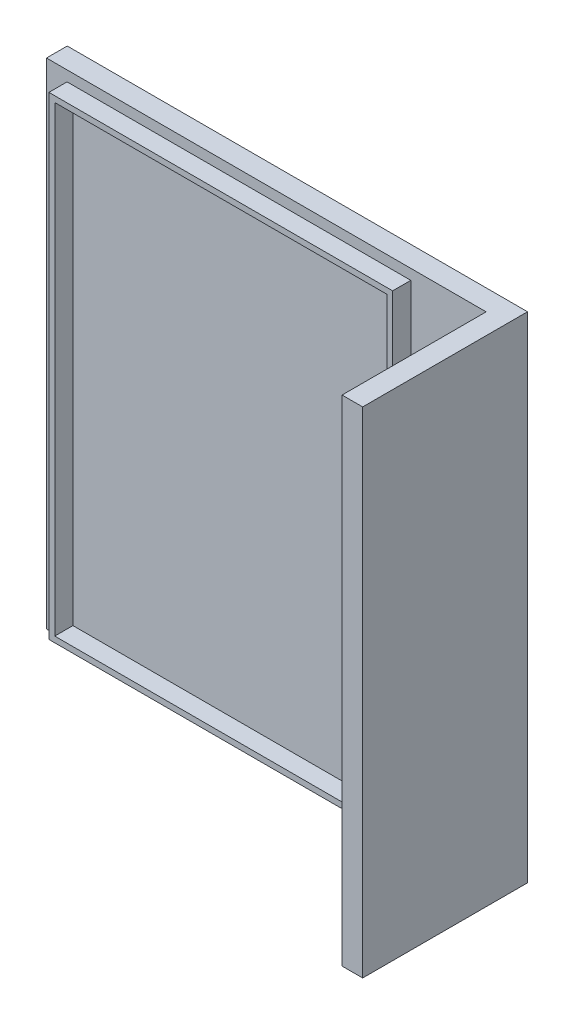
ISO-10303-21;
HEADER;
FILE_DESCRIPTION(('STEP AP214'),'2;1');
FILE_NAME('part.step','',(''),(''),'','','');
FILE_SCHEMA(('AUTOMOTIVE_DESIGN { 1 0 10303 214 1 1 1 1 }'));
ENDSEC;
DATA;
#1=APPLICATION_CONTEXT('core data for automotive mechanical design processes');
#2=APPLICATION_PROTOCOL_DEFINITION('international standard','automotive_design',2000,#1);
#3=PRODUCT_CONTEXT('',#1,'mechanical');
#4=PRODUCT('Part','Part','',(#3));
#5=PRODUCT_RELATED_PRODUCT_CATEGORY('part','',(#4));
#6=PRODUCT_DEFINITION_FORMATION('','',#4);
#7=PRODUCT_DEFINITION_CONTEXT('part definition',#1,'design');
#8=PRODUCT_DEFINITION('design','',#6,#7);
#9=PRODUCT_DEFINITION_SHAPE('','',#8);
#10=(LENGTH_UNIT() NAMED_UNIT(*) SI_UNIT(.MILLI.,.METRE.));
#11=(NAMED_UNIT(*) PLANE_ANGLE_UNIT() SI_UNIT($,.RADIAN.));
#12=(NAMED_UNIT(*) SI_UNIT($,.STERADIAN.) SOLID_ANGLE_UNIT());
#13=UNCERTAINTY_MEASURE_WITH_UNIT(LENGTH_MEASURE(1.E-05),#10,'distance_accuracy_value','');
#14=(GEOMETRIC_REPRESENTATION_CONTEXT(3) GLOBAL_UNCERTAINTY_ASSIGNED_CONTEXT((#13)) GLOBAL_UNIT_ASSIGNED_CONTEXT((#10,
#11,#12)) REPRESENTATION_CONTEXT('',''));
#15=CARTESIAN_POINT('',(0.,0.,0.));
#16=DIRECTION('',(0.,0.,1.));
#17=DIRECTION('',(1.,0.,0.));
#18=AXIS2_PLACEMENT_3D('',#15,#16,#17);
#19=CARTESIAN_POINT('',(0.,0.,1.599999848));
#20=DIRECTION('',(0.,0.,-1.));
#21=DIRECTION('',(-1.,0.,0.));
#22=AXIS2_PLACEMENT_3D('',#19,#20,#21);
#23=PLANE('',#22);
#24=DIRECTION('',(0.,1.,0.));
#25=VECTOR('',#24,1.);
#26=CARTESIAN_POINT('',(16.93545,-19.05,1.599999848));
#27=LINE('',#26,#25);
#28=CARTESIAN_POINT('',(16.93545,-19.05,1.599999848));
#29=VERTEX_POINT('',#28);
#30=CARTESIAN_POINT('',(16.93545,19.05,1.599999848));
#31=VERTEX_POINT('',#30);
#32=EDGE_CURVE('E236',#29,#31,#27,.T.);
#33=ORIENTED_EDGE('',*,*,#32,.T.);
#34=DIRECTION('',(-1.,0.,0.));
#35=VECTOR('',#34,1.);
#36=CARTESIAN_POINT('',(-16.93545,19.05,1.599999848));
#37=LINE('',#36,#35);
#38=CARTESIAN_POINT('',(-16.93545,19.05,1.599999848));
#39=VERTEX_POINT('',#38);
#40=EDGE_CURVE('E239',#31,#39,#37,.T.);
#41=ORIENTED_EDGE('',*,*,#40,.T.);
#42=DIRECTION('',(0.,-1.,0.));
#43=VECTOR('',#42,1.);
#44=CARTESIAN_POINT('',(-16.93545,-19.05,1.599999848));
#45=LINE('',#44,#43);
#46=CARTESIAN_POINT('',(-16.93545,-19.05,1.599999848));
#47=VERTEX_POINT('',#46);
#48=EDGE_CURVE('E234',#39,#47,#45,.T.);
#49=ORIENTED_EDGE('',*,*,#48,.T.);
#50=DIRECTION('',(1.,0.,0.));
#51=VECTOR('',#50,1.);
#52=CARTESIAN_POINT('',(-16.93545,-19.05,1.599999848));
#53=LINE('',#52,#51);
#54=EDGE_CURVE('E243',#47,#29,#53,.T.);
#55=ORIENTED_EDGE('',*,*,#54,.T.);
#56=EDGE_LOOP('',(#33,#41,#49,#55));
#57=FACE_BOUND('',#56,.T.);
#58=DIRECTION('',(0.,-1.,0.));
#59=VECTOR('',#58,1.);
#60=CARTESIAN_POINT('',(-15.34795,18.2499,1.599999848));
#61=LINE('',#60,#59);
#62=CARTESIAN_POINT('',(-15.34795,18.2499,1.599999848));
#63=VERTEX_POINT('',#62);
#64=CARTESIAN_POINT('',(-15.34795,-18.2499,1.599999848));
#65=VERTEX_POINT('',#64);
#66=EDGE_CURVE('E205',#63,#65,#61,.T.);
#67=ORIENTED_EDGE('',*,*,#66,.F.);
#68=DIRECTION('',(-1.,0.,0.));
#69=VECTOR('',#68,1.);
#70=CARTESIAN_POINT('',(-15.34795,18.2499,1.599999848));
#71=LINE('',#70,#69);
#72=CARTESIAN_POINT('',(11.13155,18.2499,1.599999848));
#73=VERTEX_POINT('',#72);
#74=EDGE_CURVE('E210',#73,#63,#71,.T.);
#75=ORIENTED_EDGE('',*,*,#74,.F.);
#76=DIRECTION('',(0.,1.,0.));
#77=VECTOR('',#76,1.);
#78=CARTESIAN_POINT('',(11.13155,18.2499,1.599999848));
#79=LINE('',#78,#77);
#80=CARTESIAN_POINT('',(11.13155,-18.2499,1.599999848));
#81=VERTEX_POINT('',#80);
#82=EDGE_CURVE('E57',#81,#73,#79,.T.);
#83=ORIENTED_EDGE('',*,*,#82,.F.);
#84=DIRECTION('',(1.,0.,0.));
#85=VECTOR('',#84,1.);
#86=CARTESIAN_POINT('',(-15.34795,-18.2499,1.599999848));
#87=LINE('',#86,#85);
#88=EDGE_CURVE('E52',#65,#81,#87,.T.);
#89=ORIENTED_EDGE('',*,*,#88,.F.);
#90=EDGE_LOOP('',(#67,#75,#83,#89));
#91=FACE_BOUND('',#90,.T.);
#92=ADVANCED_FACE('F35',(#57,#91),#23,.F.);
#93=CARTESIAN_POINT('',(-16.93545,19.05,1.599999848));
#94=DIRECTION('',(0.,-1.,0.));
#95=DIRECTION('',(0.,0.,-1.));
#96=AXIS2_PLACEMENT_3D('',#93,#94,#95);
#97=PLANE('',#96);
#98=DIRECTION('',(-1.,0.,0.));
#99=VECTOR('',#98,1.);
#100=CARTESIAN_POINT('',(-16.93545,19.05,0.));
#101=LINE('',#100,#99);
#102=CARTESIAN_POINT('',(18.52295,19.05,0.));
#103=VERTEX_POINT('',#102);
#104=CARTESIAN_POINT('',(-16.93545,19.05,0.));
#105=VERTEX_POINT('',#104);
#106=EDGE_CURVE('E136',#103,#105,#101,.T.);
#107=ORIENTED_EDGE('',*,*,#106,.T.);
#108=DIRECTION('',(0.,0.,-1.));
#109=VECTOR('',#108,1.);
#110=CARTESIAN_POINT('',(-16.93545,19.05,1.599999848));
#111=LINE('',#110,#109);
#112=EDGE_CURVE('E11',#39,#105,#111,.T.);
#113=ORIENTED_EDGE('',*,*,#112,.F.);
#114=ORIENTED_EDGE('',*,*,#40,.F.);
#115=DIRECTION('',(0.,0.,1.));
#116=VECTOR('',#115,1.);
#117=CARTESIAN_POINT('',(16.93545,19.05,0.));
#118=LINE('',#117,#116);
#119=CARTESIAN_POINT('',(16.93545,19.05,12.7));
#120=VERTEX_POINT('',#119);
#121=EDGE_CURVE('E172',#31,#120,#118,.T.);
#122=ORIENTED_EDGE('',*,*,#121,.T.);
#123=DIRECTION('',(-1.,0.,0.));
#124=VECTOR('',#123,1.);
#125=CARTESIAN_POINT('',(18.52295,19.05,12.7));
#126=LINE('',#125,#124);
#127=CARTESIAN_POINT('',(18.52295,19.05,12.7));
#128=VERTEX_POINT('',#127);
#129=EDGE_CURVE('E150',#128,#120,#126,.T.);
#130=ORIENTED_EDGE('',*,*,#129,.F.);
#131=DIRECTION('',(0.,0.,1.));
#132=VECTOR('',#131,1.);
#133=CARTESIAN_POINT('',(18.52295,19.05,0.));
#134=LINE('',#133,#132);
#135=EDGE_CURVE('E148',#103,#128,#134,.T.);
#136=ORIENTED_EDGE('',*,*,#135,.F.);
#137=EDGE_LOOP('',(#107,#113,#114,#122,#130,#136));
#138=FACE_BOUND('',#137,.T.);
#139=ADVANCED_FACE('F37',(#138),#97,.F.);
#140=CARTESIAN_POINT('',(-16.93545,-19.05,1.599999848));
#141=DIRECTION('',(1.,0.,0.));
#142=DIRECTION('',(0.,0.,-1.));
#143=AXIS2_PLACEMENT_3D('',#140,#141,#142);
#144=PLANE('',#143);
#145=DIRECTION('',(0.,-1.,0.));
#146=VECTOR('',#145,1.);
#147=CARTESIAN_POINT('',(-16.93545,-19.05,0.));
#148=LINE('',#147,#146);
#149=CARTESIAN_POINT('',(-16.93545,-19.05,0.));
#150=VERTEX_POINT('',#149);
#151=EDGE_CURVE('E142',#105,#150,#148,.T.);
#152=ORIENTED_EDGE('',*,*,#151,.T.);
#153=DIRECTION('',(0.,0.,-1.));
#154=VECTOR('',#153,1.);
#155=CARTESIAN_POINT('',(-16.93545,-19.05,1.599999848));
#156=LINE('',#155,#154);
#157=EDGE_CURVE('E44',#47,#150,#156,.T.);
#158=ORIENTED_EDGE('',*,*,#157,.F.);
#159=ORIENTED_EDGE('',*,*,#48,.F.);
#160=ORIENTED_EDGE('',*,*,#112,.T.);
#161=EDGE_LOOP('',(#152,#158,#159,#160));
#162=FACE_BOUND('',#161,.T.);
#163=ADVANCED_FACE('F255',(#162),#144,.F.);
#164=CARTESIAN_POINT('',(-16.93545,-19.05,1.599999848));
#165=DIRECTION('',(0.,1.,0.));
#166=DIRECTION('',(0.,0.,1.));
#167=AXIS2_PLACEMENT_3D('',#164,#165,#166);
#168=PLANE('',#167);
#169=DIRECTION('',(1.,0.,0.));
#170=VECTOR('',#169,1.);
#171=CARTESIAN_POINT('',(-16.93545,-19.05,0.));
#172=LINE('',#171,#170);
#173=CARTESIAN_POINT('',(18.52295,-19.05,0.));
#174=VERTEX_POINT('',#173);
#175=EDGE_CURVE('E240',#150,#174,#172,.T.);
#176=ORIENTED_EDGE('',*,*,#175,.T.);
#177=DIRECTION('',(0.,0.,-1.));
#178=VECTOR('',#177,1.);
#179=CARTESIAN_POINT('',(18.52295,-19.05,0.));
#180=LINE('',#179,#178);
#181=CARTESIAN_POINT('',(18.52295,-19.05,12.7));
#182=VERTEX_POINT('',#181);
#183=EDGE_CURVE('E158',#182,#174,#180,.T.);
#184=ORIENTED_EDGE('',*,*,#183,.F.);
#185=DIRECTION('',(-1.,0.,0.));
#186=VECTOR('',#185,1.);
#187=CARTESIAN_POINT('',(18.52295,-19.05,12.7));
#188=LINE('',#187,#186);
#189=CARTESIAN_POINT('',(16.93545,-19.05,12.7));
#190=VERTEX_POINT('',#189);
#191=EDGE_CURVE('E167',#182,#190,#188,.T.);
#192=ORIENTED_EDGE('',*,*,#191,.T.);
#193=DIRECTION('',(0.,0.,-1.));
#194=VECTOR('',#193,1.);
#195=CARTESIAN_POINT('',(16.93545,-19.05,0.));
#196=LINE('',#195,#194);
#197=EDGE_CURVE('E159',#190,#29,#196,.T.);
#198=ORIENTED_EDGE('',*,*,#197,.T.);
#199=ORIENTED_EDGE('',*,*,#54,.F.);
#200=ORIENTED_EDGE('',*,*,#157,.T.);
#201=EDGE_LOOP('',(#176,#184,#192,#198,#199,#200));
#202=FACE_BOUND('',#201,.T.);
#203=ADVANCED_FACE('F257',(#202),#168,.F.);
#204=CARTESIAN_POINT('',(0.,0.,0.));
#205=DIRECTION('',(0.,0.,-1.));
#206=DIRECTION('',(-1.,0.,0.));
#207=AXIS2_PLACEMENT_3D('',#204,#205,#206);
#208=PLANE('',#207);
#209=ORIENTED_EDGE('',*,*,#106,.F.);
#210=DIRECTION('',(0.,1.,0.));
#211=VECTOR('',#210,1.);
#212=CARTESIAN_POINT('',(18.52295,-19.05,0.));
#213=LINE('',#212,#211);
#214=EDGE_CURVE('E141',#174,#103,#213,.T.);
#215=ORIENTED_EDGE('',*,*,#214,.F.);
#216=ORIENTED_EDGE('',*,*,#175,.F.);
#217=ORIENTED_EDGE('',*,*,#151,.F.);
#218=EDGE_LOOP('',(#209,#215,#216,#217));
#219=FACE_BOUND('',#218,.T.);
#220=ADVANCED_FACE('F138',(#219),#208,.T.);
#221=CARTESIAN_POINT('',(0.,0.,2.999999848));
#222=DIRECTION('',(0.,0.,1.));
#223=DIRECTION('',(1.,0.,0.));
#224=AXIS2_PLACEMENT_3D('',#221,#222,#223);
#225=PLANE('',#224);
#226=DIRECTION('',(0.,-1.,0.));
#227=VECTOR('',#226,1.);
#228=CARTESIAN_POINT('',(-15.34795,18.2499,2.999999848));
#229=LINE('',#228,#227);
#230=CARTESIAN_POINT('',(-15.34795,18.2499,2.999999848));
#231=VERTEX_POINT('',#230);
#232=CARTESIAN_POINT('',(-15.34795,-18.2499,2.999999848));
#233=VERTEX_POINT('',#232);
#234=EDGE_CURVE('E206',#231,#233,#229,.T.);
#235=ORIENTED_EDGE('',*,*,#234,.T.);
#236=DIRECTION('',(1.,0.,0.));
#237=VECTOR('',#236,1.);
#238=CARTESIAN_POINT('',(-15.34795,-18.2499,2.999999848));
#239=LINE('',#238,#237);
#240=CARTESIAN_POINT('',(11.13155,-18.2499,2.999999848));
#241=VERTEX_POINT('',#240);
#242=EDGE_CURVE('E209',#233,#241,#239,.T.);
#243=ORIENTED_EDGE('',*,*,#242,.T.);
#244=DIRECTION('',(0.,1.,0.));
#245=VECTOR('',#244,1.);
#246=CARTESIAN_POINT('',(11.13155,18.2499,2.999999848));
#247=LINE('',#246,#245);
#248=CARTESIAN_POINT('',(11.13155,18.2499,2.999999848));
#249=VERTEX_POINT('',#248);
#250=EDGE_CURVE('E212',#241,#249,#247,.T.);
#251=ORIENTED_EDGE('',*,*,#250,.T.);
#252=DIRECTION('',(-1.,0.,0.));
#253=VECTOR('',#252,1.);
#254=CARTESIAN_POINT('',(-15.34795,18.2499,2.999999848));
#255=LINE('',#254,#253);
#256=EDGE_CURVE('E214',#249,#231,#255,.T.);
#257=ORIENTED_EDGE('',*,*,#256,.T.);
#258=EDGE_LOOP('',(#235,#243,#251,#257));
#259=FACE_BOUND('',#258,.T.);
#260=DIRECTION('',(0.,-1.,0.));
#261=VECTOR('',#260,1.);
#262=CARTESIAN_POINT('',(-14.89795,17.7999,2.999999848));
#263=LINE('',#262,#261);
#264=CARTESIAN_POINT('',(-14.89795,17.7999,2.999999848));
#265=VERTEX_POINT('',#264);
#266=CARTESIAN_POINT('',(-14.89795,-17.7999,2.999999848));
#267=VERTEX_POINT('',#266);
#268=EDGE_CURVE('E177',#265,#267,#263,.T.);
#269=ORIENTED_EDGE('',*,*,#268,.F.);
#270=DIRECTION('',(-1.,0.,0.));
#271=VECTOR('',#270,1.);
#272=CARTESIAN_POINT('',(-14.89795,17.7999,2.999999848));
#273=LINE('',#272,#271);
#274=CARTESIAN_POINT('',(10.68155,17.7999,2.999999848));
#275=VERTEX_POINT('',#274);
#276=EDGE_CURVE('E175',#275,#265,#273,.T.);
#277=ORIENTED_EDGE('',*,*,#276,.F.);
#278=DIRECTION('',(0.,1.,0.));
#279=VECTOR('',#278,1.);
#280=CARTESIAN_POINT('',(10.68155,17.7999,2.999999848));
#281=LINE('',#280,#279);
#282=CARTESIAN_POINT('',(10.68155,-17.7999,2.999999848));
#283=VERTEX_POINT('',#282);
#284=EDGE_CURVE('E183',#283,#275,#281,.T.);
#285=ORIENTED_EDGE('',*,*,#284,.F.);
#286=DIRECTION('',(1.,0.,0.));
#287=VECTOR('',#286,1.);
#288=CARTESIAN_POINT('',(-14.89795,-17.7999,2.999999848));
#289=LINE('',#288,#287);
#290=EDGE_CURVE('E180',#267,#283,#289,.T.);
#291=ORIENTED_EDGE('',*,*,#290,.F.);
#292=EDGE_LOOP('',(#269,#277,#285,#291));
#293=FACE_BOUND('',#292,.T.);
#294=ADVANCED_FACE('F277',(#259,#293),#225,.T.);
#295=CARTESIAN_POINT('',(-15.34795,18.2499,2.999999848));
#296=DIRECTION('',(1.,0.,0.));
#297=DIRECTION('',(0.,1.,0.));
#298=AXIS2_PLACEMENT_3D('',#295,#296,#297);
#299=PLANE('',#298);
#300=ORIENTED_EDGE('',*,*,#66,.T.);
#301=DIRECTION('',(0.,0.,-1.));
#302=VECTOR('',#301,1.);
#303=CARTESIAN_POINT('',(-15.34795,-18.2499,2.999999848));
#304=LINE('',#303,#302);
#305=EDGE_CURVE('E145',#233,#65,#304,.T.);
#306=ORIENTED_EDGE('',*,*,#305,.F.);
#307=ORIENTED_EDGE('',*,*,#234,.F.);
#308=DIRECTION('',(0.,0.,-1.));
#309=VECTOR('',#308,1.);
#310=CARTESIAN_POINT('',(-15.34795,18.2499,2.999999848));
#311=LINE('',#310,#309);
#312=EDGE_CURVE('E216',#231,#63,#311,.T.);
#313=ORIENTED_EDGE('',*,*,#312,.T.);
#314=EDGE_LOOP('',(#300,#306,#307,#313));
#315=FACE_BOUND('',#314,.T.);
#316=ADVANCED_FACE('F275',(#315),#299,.F.);
#317=CARTESIAN_POINT('',(-15.34795,-18.2499,2.999999848));
#318=DIRECTION('',(0.,1.,0.));
#319=DIRECTION('',(-1.,0.,0.));
#320=AXIS2_PLACEMENT_3D('',#317,#318,#319);
#321=PLANE('',#320);
#322=ORIENTED_EDGE('',*,*,#88,.T.);
#323=DIRECTION('',(0.,0.,-1.));
#324=VECTOR('',#323,1.);
#325=CARTESIAN_POINT('',(11.13155,-18.2499,2.999999848));
#326=LINE('',#325,#324);
#327=EDGE_CURVE('E228',#241,#81,#326,.T.);
#328=ORIENTED_EDGE('',*,*,#327,.F.);
#329=ORIENTED_EDGE('',*,*,#242,.F.);
#330=ORIENTED_EDGE('',*,*,#305,.T.);
#331=EDGE_LOOP('',(#322,#328,#329,#330));
#332=FACE_BOUND('',#331,.T.);
#333=ADVANCED_FACE('F284',(#332),#321,.F.);
#334=CARTESIAN_POINT('',(11.13155,18.2499,2.999999848));
#335=DIRECTION('',(-1.,0.,0.));
#336=DIRECTION('',(0.,-1.,0.));
#337=AXIS2_PLACEMENT_3D('',#334,#335,#336);
#338=PLANE('',#337);
#339=ORIENTED_EDGE('',*,*,#82,.T.);
#340=DIRECTION('',(0.,0.,-1.));
#341=VECTOR('',#340,1.);
#342=CARTESIAN_POINT('',(11.13155,18.2499,2.999999848));
#343=LINE('',#342,#341);
#344=EDGE_CURVE('E225',#249,#73,#343,.T.);
#345=ORIENTED_EDGE('',*,*,#344,.F.);
#346=ORIENTED_EDGE('',*,*,#250,.F.);
#347=ORIENTED_EDGE('',*,*,#327,.T.);
#348=EDGE_LOOP('',(#339,#345,#346,#347));
#349=FACE_BOUND('',#348,.T.);
#350=ADVANCED_FACE('F282',(#349),#338,.F.);
#351=CARTESIAN_POINT('',(-15.34795,18.2499,2.999999848));
#352=DIRECTION('',(0.,-1.,0.));
#353=DIRECTION('',(1.,0.,0.));
#354=AXIS2_PLACEMENT_3D('',#351,#352,#353);
#355=PLANE('',#354);
#356=ORIENTED_EDGE('',*,*,#74,.T.);
#357=ORIENTED_EDGE('',*,*,#312,.F.);
#358=ORIENTED_EDGE('',*,*,#256,.F.);
#359=ORIENTED_EDGE('',*,*,#344,.T.);
#360=EDGE_LOOP('',(#356,#357,#358,#359));
#361=FACE_BOUND('',#360,.T.);
#362=ADVANCED_FACE('F271',(#361),#355,.F.);
#363=CARTESIAN_POINT('',(-14.89795,17.7999,2.999999848));
#364=DIRECTION('',(0.,-1.,0.));
#365=DIRECTION('',(0.,0.,-1.));
#366=AXIS2_PLACEMENT_3D('',#363,#364,#365);
#367=PLANE('',#366);
#368=DIRECTION('',(-1.,0.,0.));
#369=VECTOR('',#368,1.);
#370=CARTESIAN_POINT('',(-14.89795,17.7999,1.599999848));
#371=LINE('',#370,#369);
#372=CARTESIAN_POINT('',(10.68155,17.7999,1.599999848));
#373=VERTEX_POINT('',#372);
#374=CARTESIAN_POINT('',(-14.89795,17.7999,1.599999848));
#375=VERTEX_POINT('',#374);
#376=EDGE_CURVE('E186',#373,#375,#371,.T.);
#377=ORIENTED_EDGE('',*,*,#376,.F.);
#378=DIRECTION('',(0.,0.,-1.));
#379=VECTOR('',#378,1.);
#380=CARTESIAN_POINT('',(10.68155,17.7999,2.999999848));
#381=LINE('',#380,#379);
#382=EDGE_CURVE('E185',#275,#373,#381,.T.);
#383=ORIENTED_EDGE('',*,*,#382,.F.);
#384=ORIENTED_EDGE('',*,*,#276,.T.);
#385=DIRECTION('',(0.,0.,-1.));
#386=VECTOR('',#385,1.);
#387=CARTESIAN_POINT('',(-14.89795,17.7999,2.999999848));
#388=LINE('',#387,#386);
#389=EDGE_CURVE('E202',#265,#375,#388,.T.);
#390=ORIENTED_EDGE('',*,*,#389,.T.);
#391=EDGE_LOOP('',(#377,#383,#384,#390));
#392=FACE_BOUND('',#391,.T.);
#393=ADVANCED_FACE('F352',(#392),#367,.T.);
#394=CARTESIAN_POINT('',(-14.89795,17.7999,2.999999848));
#395=DIRECTION('',(1.,0.,0.));
#396=DIRECTION('',(0.,1.,0.));
#397=AXIS2_PLACEMENT_3D('',#394,#395,#396);
#398=PLANE('',#397);
#399=DIRECTION('',(0.,-1.,0.));
#400=VECTOR('',#399,1.);
#401=CARTESIAN_POINT('',(-14.89795,17.7999,1.599999848));
#402=LINE('',#401,#400);
#403=CARTESIAN_POINT('',(-14.89795,-17.7999,1.599999848));
#404=VERTEX_POINT('',#403);
#405=EDGE_CURVE('E189',#375,#404,#402,.T.);
#406=ORIENTED_EDGE('',*,*,#405,.F.);
#407=ORIENTED_EDGE('',*,*,#389,.F.);
#408=ORIENTED_EDGE('',*,*,#268,.T.);
#409=DIRECTION('',(0.,0.,-1.));
#410=VECTOR('',#409,1.);
#411=CARTESIAN_POINT('',(-14.89795,-17.7999,2.999999848));
#412=LINE('',#411,#410);
#413=EDGE_CURVE('E200',#267,#404,#412,.T.);
#414=ORIENTED_EDGE('',*,*,#413,.T.);
#415=EDGE_LOOP('',(#406,#407,#408,#414));
#416=FACE_BOUND('',#415,.T.);
#417=ADVANCED_FACE('F342',(#416),#398,.T.);
#418=CARTESIAN_POINT('',(-14.89795,-17.7999,2.999999848));
#419=DIRECTION('',(0.,1.,0.));
#420=DIRECTION('',(0.,0.,1.));
#421=AXIS2_PLACEMENT_3D('',#418,#419,#420);
#422=PLANE('',#421);
#423=DIRECTION('',(1.,0.,0.));
#424=VECTOR('',#423,1.);
#425=CARTESIAN_POINT('',(-14.89795,-17.7999,1.599999848));
#426=LINE('',#425,#424);
#427=CARTESIAN_POINT('',(10.68155,-17.7999,1.599999848));
#428=VERTEX_POINT('',#427);
#429=EDGE_CURVE('E192',#404,#428,#426,.T.);
#430=ORIENTED_EDGE('',*,*,#429,.F.);
#431=ORIENTED_EDGE('',*,*,#413,.F.);
#432=ORIENTED_EDGE('',*,*,#290,.T.);
#433=DIRECTION('',(0.,0.,-1.));
#434=VECTOR('',#433,1.);
#435=CARTESIAN_POINT('',(10.68155,-17.7999,2.999999848));
#436=LINE('',#435,#434);
#437=EDGE_CURVE('E198',#283,#428,#436,.T.);
#438=ORIENTED_EDGE('',*,*,#437,.T.);
#439=EDGE_LOOP('',(#430,#431,#432,#438));
#440=FACE_BOUND('',#439,.T.);
#441=ADVANCED_FACE('F332',(#440),#422,.T.);
#442=CARTESIAN_POINT('',(10.68155,17.7999,2.999999848));
#443=DIRECTION('',(-1.,0.,0.));
#444=DIRECTION('',(0.,-1.,0.));
#445=AXIS2_PLACEMENT_3D('',#442,#443,#444);
#446=PLANE('',#445);
#447=DIRECTION('',(0.,1.,0.));
#448=VECTOR('',#447,1.);
#449=CARTESIAN_POINT('',(10.68155,17.7999,1.599999848));
#450=LINE('',#449,#448);
#451=EDGE_CURVE('E178',#428,#373,#450,.T.);
#452=ORIENTED_EDGE('',*,*,#451,.F.);
#453=ORIENTED_EDGE('',*,*,#437,.F.);
#454=ORIENTED_EDGE('',*,*,#284,.T.);
#455=ORIENTED_EDGE('',*,*,#382,.T.);
#456=EDGE_LOOP('',(#452,#453,#454,#455));
#457=FACE_BOUND('',#456,.T.);
#458=ADVANCED_FACE('F297',(#457),#446,.T.);
#459=ORIENTED_EDGE('',*,*,#451,.T.);
#460=ORIENTED_EDGE('',*,*,#376,.T.);
#461=ORIENTED_EDGE('',*,*,#405,.T.);
#462=ORIENTED_EDGE('',*,*,#429,.T.);
#463=EDGE_LOOP('',(#459,#460,#461,#462));
#464=FACE_BOUND('',#463,.T.);
#465=ADVANCED_FACE('F266',(#464),#23,.F.);
#466=CARTESIAN_POINT('',(18.52295,-19.05,12.7));
#467=DIRECTION('',(0.,0.,-1.));
#468=DIRECTION('',(-1.,0.,0.));
#469=AXIS2_PLACEMENT_3D('',#466,#467,#468);
#470=PLANE('',#469);
#471=DIRECTION('',(0.,-1.,0.));
#472=VECTOR('',#471,1.);
#473=CARTESIAN_POINT('',(16.93545,-19.05,12.7));
#474=LINE('',#473,#472);
#475=EDGE_CURVE('E162',#120,#190,#474,.T.);
#476=ORIENTED_EDGE('',*,*,#475,.T.);
#477=ORIENTED_EDGE('',*,*,#191,.F.);
#478=DIRECTION('',(0.,-1.,0.));
#479=VECTOR('',#478,1.);
#480=CARTESIAN_POINT('',(18.52295,-19.05,12.7));
#481=LINE('',#480,#479);
#482=EDGE_CURVE('E153',#128,#182,#481,.T.);
#483=ORIENTED_EDGE('',*,*,#482,.F.);
#484=ORIENTED_EDGE('',*,*,#129,.T.);
#485=EDGE_LOOP('',(#476,#477,#483,#484));
#486=FACE_BOUND('',#485,.T.);
#487=ADVANCED_FACE('F296',(#486),#470,.F.);
#488=CARTESIAN_POINT('',(18.52295,0.,0.));
#489=DIRECTION('',(1.,0.,0.));
#490=DIRECTION('',(0.,0.,-1.));
#491=AXIS2_PLACEMENT_3D('',#488,#489,#490);
#492=PLANE('',#491);
#493=ORIENTED_EDGE('',*,*,#214,.T.);
#494=ORIENTED_EDGE('',*,*,#135,.T.);
#495=ORIENTED_EDGE('',*,*,#482,.T.);
#496=ORIENTED_EDGE('',*,*,#183,.T.);
#497=EDGE_LOOP('',(#493,#494,#495,#496));
#498=FACE_BOUND('',#497,.T.);
#499=ADVANCED_FACE('F156',(#498),#492,.T.);
#500=CARTESIAN_POINT('',(16.93545,0.,0.));
#501=DIRECTION('',(1.,0.,0.));
#502=DIRECTION('',(0.,0.,-1.));
#503=AXIS2_PLACEMENT_3D('',#500,#501,#502);
#504=PLANE('',#503);
#505=ORIENTED_EDGE('',*,*,#32,.F.);
#506=ORIENTED_EDGE('',*,*,#197,.F.);
#507=ORIENTED_EDGE('',*,*,#475,.F.);
#508=ORIENTED_EDGE('',*,*,#121,.F.);
#509=EDGE_LOOP('',(#505,#506,#507,#508));
#510=FACE_BOUND('',#509,.T.);
#511=ADVANCED_FACE('F263',(#510),#504,.F.);
#512=CLOSED_SHELL('',(#92,#139,#163,#203,#220,#294,#316,#333,#350,#362,#393,#417,#441,#458,#465,
#487,#499,#511));
#513=MANIFOLD_SOLID_BREP('B2',#512);
#514=ADVANCED_BREP_SHAPE_REPRESENTATION('',(#18,#513),#14);
#515=SHAPE_DEFINITION_REPRESENTATION(#9,#514);
ENDSEC;
END-ISO-10303-21;
